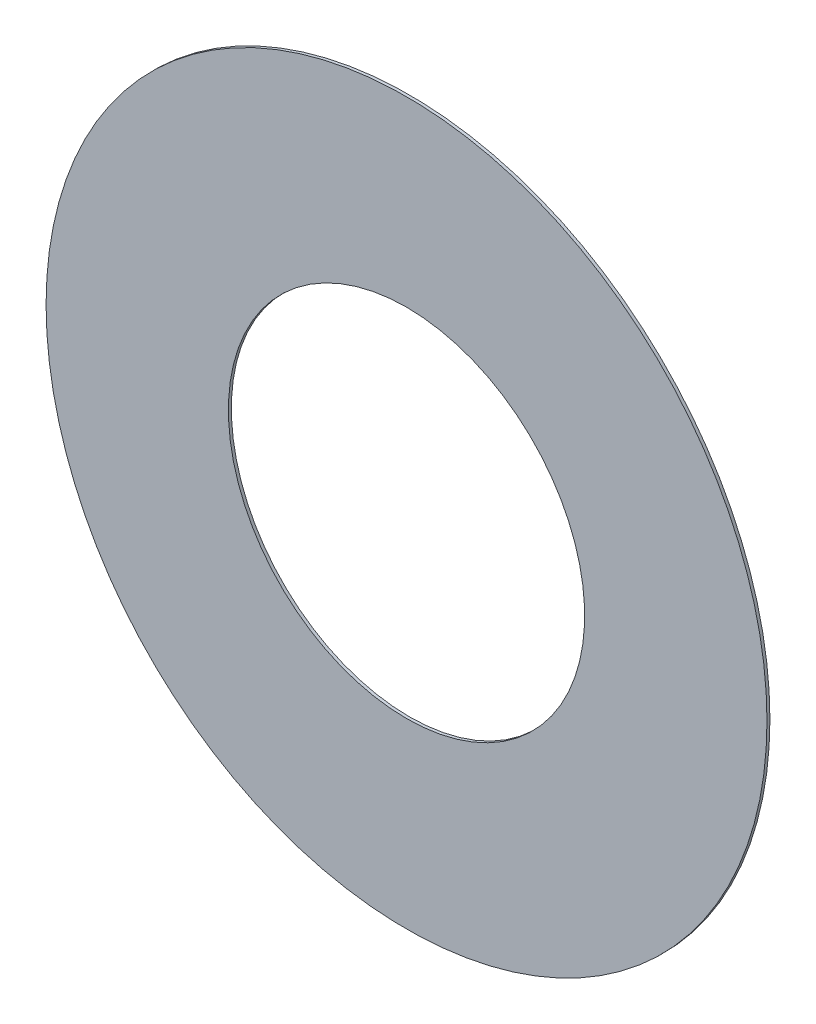
ISO-10303-21;
HEADER;
FILE_DESCRIPTION(('STEP AP214'),'2;1');
FILE_NAME('part.step','',(''),(''),'','','');
FILE_SCHEMA(('AUTOMOTIVE_DESIGN { 1 0 10303 214 1 1 1 1 }'));
ENDSEC;
DATA;
#1=APPLICATION_CONTEXT('core data for automotive mechanical design processes');
#2=APPLICATION_PROTOCOL_DEFINITION('international standard','automotive_design',2000,#1);
#3=PRODUCT_CONTEXT('',#1,'mechanical');
#4=PRODUCT('Part','Part','',(#3));
#5=PRODUCT_RELATED_PRODUCT_CATEGORY('part','',(#4));
#6=PRODUCT_DEFINITION_FORMATION('','',#4);
#7=PRODUCT_DEFINITION_CONTEXT('part definition',#1,'design');
#8=PRODUCT_DEFINITION('design','',#6,#7);
#9=PRODUCT_DEFINITION_SHAPE('','',#8);
#10=(LENGTH_UNIT() NAMED_UNIT(*) SI_UNIT(.MILLI.,.METRE.));
#11=(NAMED_UNIT(*) PLANE_ANGLE_UNIT() SI_UNIT($,.RADIAN.));
#12=(NAMED_UNIT(*) SI_UNIT($,.STERADIAN.) SOLID_ANGLE_UNIT());
#13=UNCERTAINTY_MEASURE_WITH_UNIT(LENGTH_MEASURE(1.E-05),#10,'distance_accuracy_value','');
#14=(GEOMETRIC_REPRESENTATION_CONTEXT(3) GLOBAL_UNCERTAINTY_ASSIGNED_CONTEXT((#13)) GLOBAL_UNIT_ASSIGNED_CONTEXT((#10,
#11,#12)) REPRESENTATION_CONTEXT('',''));
#15=CARTESIAN_POINT('',(0.,0.,0.));
#16=DIRECTION('',(0.,0.,1.));
#17=DIRECTION('',(1.,0.,0.));
#18=AXIS2_PLACEMENT_3D('',#15,#16,#17);
#19=CARTESIAN_POINT('',(164.,-134.,-0.045));
#20=DIRECTION('',(0.,0.,-1.));
#21=DIRECTION('',(0.,-1.,0.));
#22=AXIS2_PLACEMENT_3D('',#19,#20,#21);
#23=CYLINDRICAL_SURFACE('',#22,2.125);
#24=CARTESIAN_POINT('',(164.,-134.,1.6));
#25=DIRECTION('',(0.,0.,-1.));
#26=DIRECTION('',(0.,-1.,0.));
#27=AXIS2_PLACEMENT_3D('',#24,#25,#26);
#28=CIRCLE('',#27,2.125);
#29=CARTESIAN_POINT('',(164.,-136.125,1.6));
#30=VERTEX_POINT('',#29);
#31=EDGE_CURVE('E26',#30,#30,#28,.T.);
#32=ORIENTED_EDGE('',*,*,#31,.T.);
#33=DIRECTION('',(0.,0.,1.));
#34=VECTOR('',#33,1.);
#35=CARTESIAN_POINT('',(164.,-136.125,-0.045));
#36=LINE('',#35,#34);
#37=CARTESIAN_POINT('',(164.,-136.125,1.635));
#38=VERTEX_POINT('',#37);
#39=EDGE_CURVE('E11',#30,#38,#36,.T.);
#40=ORIENTED_EDGE('',*,*,#39,.T.);
#41=CARTESIAN_POINT('',(164.,-134.,1.635));
#42=DIRECTION('',(0.,0.,-1.));
#43=DIRECTION('',(0.,-1.,0.));
#44=AXIS2_PLACEMENT_3D('',#41,#42,#43);
#45=CIRCLE('',#44,2.125);
#46=EDGE_CURVE('E66',#38,#38,#45,.T.);
#47=ORIENTED_EDGE('',*,*,#46,.F.);
#48=ORIENTED_EDGE('',*,*,#39,.F.);
#49=EDGE_LOOP('',(#32,#40,#47,#48));
#50=FACE_BOUND('',#49,.T.);
#51=ADVANCED_FACE('F17',(#50),#23,.F.);
#52=CARTESIAN_POINT('',(164.,-134.,1.6));
#53=DIRECTION('',(0.,0.,1.));
#54=DIRECTION('',(1.,0.,0.));
#55=AXIS2_PLACEMENT_3D('',#52,#53,#54);
#56=PLANE('',#55);
#57=ORIENTED_EDGE('',*,*,#31,.F.);
#58=EDGE_LOOP('',(#57));
#59=FACE_BOUND('',#58,.T.);
#60=CARTESIAN_POINT('',(164.,-134.,1.6));
#61=DIRECTION('',(0.,0.,1.));
#62=DIRECTION('',(1.,0.,0.));
#63=AXIS2_PLACEMENT_3D('',#60,#61,#62);
#64=CIRCLE('',#63,4.3);
#65=CARTESIAN_POINT('',(168.3,-134.,1.6));
#66=VERTEX_POINT('',#65);
#67=EDGE_CURVE('E53',#66,#66,#64,.T.);
#68=ORIENTED_EDGE('',*,*,#67,.F.);
#69=EDGE_LOOP('',(#68));
#70=FACE_BOUND('',#69,.T.);
#71=ADVANCED_FACE('F74',(#59,#70),#56,.F.);
#72=CARTESIAN_POINT('',(164.,-134.,1.635));
#73=DIRECTION('',(0.,0.,1.));
#74=DIRECTION('',(1.,0.,0.));
#75=AXIS2_PLACEMENT_3D('',#72,#73,#74);
#76=PLANE('',#75);
#77=ORIENTED_EDGE('',*,*,#46,.T.);
#78=EDGE_LOOP('',(#77));
#79=FACE_BOUND('',#78,.T.);
#80=CARTESIAN_POINT('',(164.,-134.,1.635));
#81=DIRECTION('',(0.,0.,1.));
#82=DIRECTION('',(1.,0.,0.));
#83=AXIS2_PLACEMENT_3D('',#80,#81,#82);
#84=CIRCLE('',#83,4.3);
#85=CARTESIAN_POINT('',(168.3,-134.,1.635));
#86=VERTEX_POINT('',#85);
#87=EDGE_CURVE('E51',#86,#86,#84,.T.);
#88=ORIENTED_EDGE('',*,*,#87,.T.);
#89=EDGE_LOOP('',(#88));
#90=FACE_BOUND('',#89,.T.);
#91=ADVANCED_FACE('F57',(#79,#90),#76,.T.);
#92=CARTESIAN_POINT('',(164.,-134.,1.6));
#93=DIRECTION('',(0.,0.,1.));
#94=DIRECTION('',(1.,0.,0.));
#95=AXIS2_PLACEMENT_3D('',#92,#93,#94);
#96=CYLINDRICAL_SURFACE('',#95,4.3);
#97=ORIENTED_EDGE('',*,*,#87,.F.);
#98=DIRECTION('',(0.,0.,1.));
#99=VECTOR('',#98,1.);
#100=CARTESIAN_POINT('',(168.3,-134.,1.6));
#101=LINE('',#100,#99);
#102=EDGE_CURVE('E48',#66,#86,#101,.T.);
#103=ORIENTED_EDGE('',*,*,#102,.F.);
#104=ORIENTED_EDGE('',*,*,#67,.T.);
#105=ORIENTED_EDGE('',*,*,#102,.T.);
#106=EDGE_LOOP('',(#97,#103,#104,#105));
#107=FACE_BOUND('',#106,.T.);
#108=ADVANCED_FACE('F50',(#107),#96,.T.);
#109=CLOSED_SHELL('',(#51,#71,#91,#108));
#110=MANIFOLD_SOLID_BREP('B1',#109);
#111=ADVANCED_BREP_SHAPE_REPRESENTATION('',(#18,#110),#14);
#112=SHAPE_DEFINITION_REPRESENTATION(#9,#111);
ENDSEC;
END-ISO-10303-21;
